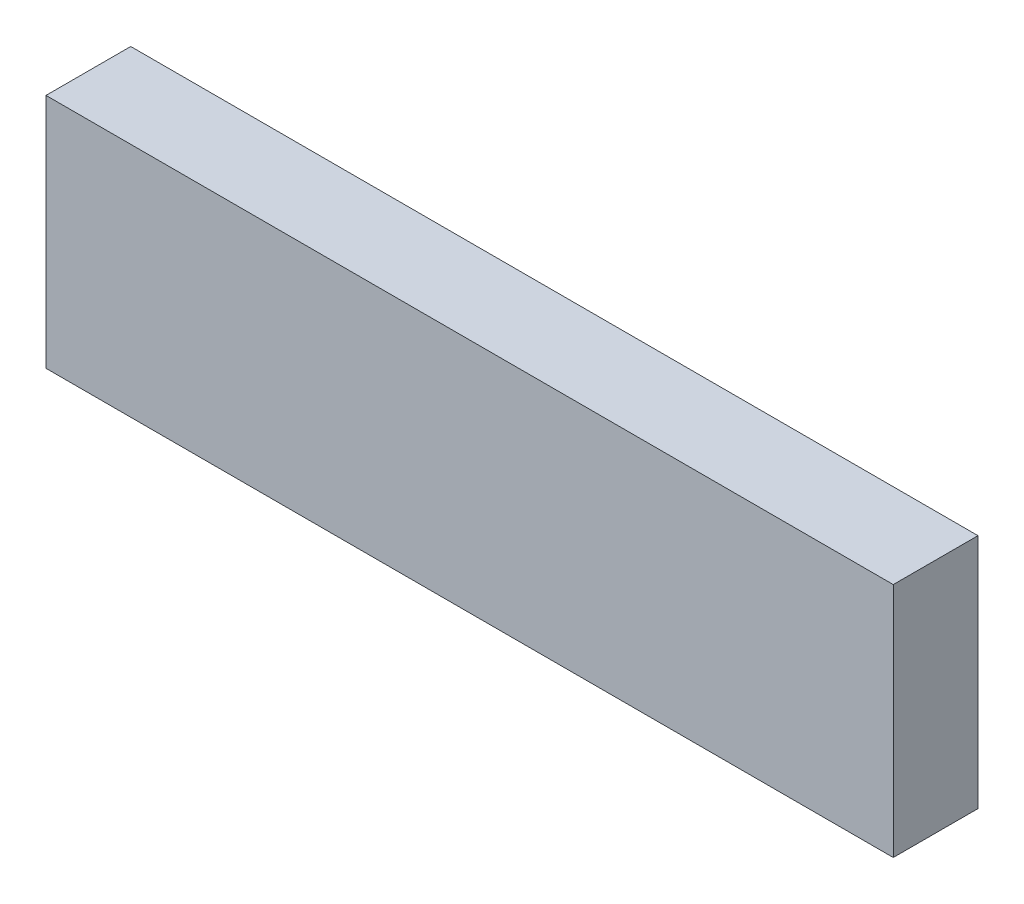
ISO-10303-21;
HEADER;
FILE_DESCRIPTION(('STEP AP214'),'2;1');
FILE_NAME('part.step','',(''),(''),'','','');
FILE_SCHEMA(('AUTOMOTIVE_DESIGN { 1 0 10303 214 1 1 1 1 }'));
ENDSEC;
DATA;
#1=APPLICATION_CONTEXT('core data for automotive mechanical design processes');
#2=APPLICATION_PROTOCOL_DEFINITION('international standard','automotive_design',2000,#1);
#3=PRODUCT_CONTEXT('',#1,'mechanical');
#4=PRODUCT('Part','Part','',(#3));
#5=PRODUCT_RELATED_PRODUCT_CATEGORY('part','',(#4));
#6=PRODUCT_DEFINITION_FORMATION('','',#4);
#7=PRODUCT_DEFINITION_CONTEXT('part definition',#1,'design');
#8=PRODUCT_DEFINITION('design','',#6,#7);
#9=PRODUCT_DEFINITION_SHAPE('','',#8);
#10=(LENGTH_UNIT() NAMED_UNIT(*) SI_UNIT(.MILLI.,.METRE.));
#11=(NAMED_UNIT(*) PLANE_ANGLE_UNIT() SI_UNIT($,.RADIAN.));
#12=(NAMED_UNIT(*) SI_UNIT($,.STERADIAN.) SOLID_ANGLE_UNIT());
#13=UNCERTAINTY_MEASURE_WITH_UNIT(LENGTH_MEASURE(1.E-05),#10,'distance_accuracy_value','');
#14=(GEOMETRIC_REPRESENTATION_CONTEXT(3) GLOBAL_UNCERTAINTY_ASSIGNED_CONTEXT((#13)) GLOBAL_UNIT_ASSIGNED_CONTEXT((#10,
#11,#12)) REPRESENTATION_CONTEXT('',''));
#15=CARTESIAN_POINT('',(0.,0.,0.));
#16=DIRECTION('',(0.,0.,1.));
#17=DIRECTION('',(1.,0.,0.));
#18=AXIS2_PLACEMENT_3D('',#15,#16,#17);
#19=CARTESIAN_POINT('',(0.,0.,5.));
#20=DIRECTION('',(1.,0.,0.));
#21=DIRECTION('',(0.,0.,-1.));
#22=AXIS2_PLACEMENT_3D('',#19,#20,#21);
#23=PLANE('',#22);
#24=DIRECTION('',(0.,-1.,0.));
#25=VECTOR('',#24,1.);
#26=CARTESIAN_POINT('',(0.,0.,0.));
#27=LINE('',#26,#25);
#28=CARTESIAN_POINT('',(0.,13.95,0.));
#29=VERTEX_POINT('',#28);
#30=CARTESIAN_POINT('',(0.,0.,0.));
#31=VERTEX_POINT('',#30);
#32=EDGE_CURVE('E107',#29,#31,#27,.T.);
#33=ORIENTED_EDGE('',*,*,#32,.T.);
#34=DIRECTION('',(0.,0.,-1.));
#35=VECTOR('',#34,1.);
#36=CARTESIAN_POINT('',(0.,0.,5.));
#37=LINE('',#36,#35);
#38=CARTESIAN_POINT('',(0.,0.,5.));
#39=VERTEX_POINT('',#38);
#40=EDGE_CURVE('E11',#39,#31,#37,.T.);
#41=ORIENTED_EDGE('',*,*,#40,.F.);
#42=DIRECTION('',(0.,-1.,0.));
#43=VECTOR('',#42,1.);
#44=CARTESIAN_POINT('',(0.,0.,5.));
#45=LINE('',#44,#43);
#46=CARTESIAN_POINT('',(0.,13.95,5.));
#47=VERTEX_POINT('',#46);
#48=EDGE_CURVE('E91',#47,#39,#45,.T.);
#49=ORIENTED_EDGE('',*,*,#48,.F.);
#50=DIRECTION('',(0.,0.,-1.));
#51=VECTOR('',#50,1.);
#52=CARTESIAN_POINT('',(0.,13.95,5.));
#53=LINE('',#52,#51);
#54=EDGE_CURVE('E103',#47,#29,#53,.T.);
#55=ORIENTED_EDGE('',*,*,#54,.T.);
#56=EDGE_LOOP('',(#33,#41,#49,#55));
#57=FACE_BOUND('',#56,.T.);
#58=ADVANCED_FACE('F39',(#57),#23,.F.);
#59=CARTESIAN_POINT('',(0.,0.,5.));
#60=DIRECTION('',(0.,1.,0.));
#61=DIRECTION('',(0.,0.,1.));
#62=AXIS2_PLACEMENT_3D('',#59,#60,#61);
#63=PLANE('',#62);
#64=DIRECTION('',(1.,0.,0.));
#65=VECTOR('',#64,1.);
#66=CARTESIAN_POINT('',(0.,0.,0.));
#67=LINE('',#66,#65);
#68=CARTESIAN_POINT('',(50.,0.,0.));
#69=VERTEX_POINT('',#68);
#70=EDGE_CURVE('E96',#31,#69,#67,.T.);
#71=ORIENTED_EDGE('',*,*,#70,.T.);
#72=DIRECTION('',(0.,0.,-1.));
#73=VECTOR('',#72,1.);
#74=CARTESIAN_POINT('',(50.,0.,5.));
#75=LINE('',#74,#73);
#76=CARTESIAN_POINT('',(50.,0.,5.));
#77=VERTEX_POINT('',#76);
#78=EDGE_CURVE('E48',#77,#69,#75,.T.);
#79=ORIENTED_EDGE('',*,*,#78,.F.);
#80=DIRECTION('',(1.,0.,0.));
#81=VECTOR('',#80,1.);
#82=CARTESIAN_POINT('',(0.,0.,5.));
#83=LINE('',#82,#81);
#84=EDGE_CURVE('E86',#39,#77,#83,.T.);
#85=ORIENTED_EDGE('',*,*,#84,.F.);
#86=ORIENTED_EDGE('',*,*,#40,.T.);
#87=EDGE_LOOP('',(#71,#79,#85,#86));
#88=FACE_BOUND('',#87,.T.);
#89=ADVANCED_FACE('F95',(#88),#63,.F.);
#90=CARTESIAN_POINT('',(50.,0.,5.));
#91=DIRECTION('',(-1.,0.,0.));
#92=DIRECTION('',(0.,0.,1.));
#93=AXIS2_PLACEMENT_3D('',#90,#91,#92);
#94=PLANE('',#93);
#95=DIRECTION('',(0.,1.,0.));
#96=VECTOR('',#95,1.);
#97=CARTESIAN_POINT('',(50.,0.,0.));
#98=LINE('',#97,#96);
#99=CARTESIAN_POINT('',(50.,13.95,0.));
#100=VERTEX_POINT('',#99);
#101=EDGE_CURVE('E73',#69,#100,#98,.T.);
#102=ORIENTED_EDGE('',*,*,#101,.T.);
#103=DIRECTION('',(0.,0.,-1.));
#104=VECTOR('',#103,1.);
#105=CARTESIAN_POINT('',(50.,13.95,5.));
#106=LINE('',#105,#104);
#107=CARTESIAN_POINT('',(50.,13.95,5.));
#108=VERTEX_POINT('',#107);
#109=EDGE_CURVE('E98',#108,#100,#106,.T.);
#110=ORIENTED_EDGE('',*,*,#109,.F.);
#111=DIRECTION('',(0.,1.,0.));
#112=VECTOR('',#111,1.);
#113=CARTESIAN_POINT('',(50.,0.,5.));
#114=LINE('',#113,#112);
#115=EDGE_CURVE('E89',#77,#108,#114,.T.);
#116=ORIENTED_EDGE('',*,*,#115,.F.);
#117=ORIENTED_EDGE('',*,*,#78,.T.);
#118=EDGE_LOOP('',(#102,#110,#116,#117));
#119=FACE_BOUND('',#118,.T.);
#120=ADVANCED_FACE('F99',(#119),#94,.F.);
#121=CARTESIAN_POINT('',(0.,13.95,5.));
#122=DIRECTION('',(0.,-1.,0.));
#123=DIRECTION('',(1.,0.,0.));
#124=AXIS2_PLACEMENT_3D('',#121,#122,#123);
#125=PLANE('',#124);
#126=DIRECTION('',(-1.,0.,0.));
#127=VECTOR('',#126,1.);
#128=CARTESIAN_POINT('',(0.,13.95,0.));
#129=LINE('',#128,#127);
#130=EDGE_CURVE('E79',#100,#29,#129,.T.);
#131=ORIENTED_EDGE('',*,*,#130,.T.);
#132=ORIENTED_EDGE('',*,*,#54,.F.);
#133=DIRECTION('',(-1.,0.,0.));
#134=VECTOR('',#133,1.);
#135=CARTESIAN_POINT('',(0.,13.95,5.));
#136=LINE('',#135,#134);
#137=EDGE_CURVE('E56',#108,#47,#136,.T.);
#138=ORIENTED_EDGE('',*,*,#137,.F.);
#139=ORIENTED_EDGE('',*,*,#109,.T.);
#140=EDGE_LOOP('',(#131,#132,#138,#139));
#141=FACE_BOUND('',#140,.T.);
#142=ADVANCED_FACE('F120',(#141),#125,.F.);
#143=CARTESIAN_POINT('',(0.,0.,5.));
#144=DIRECTION('',(0.,0.,-1.));
#145=DIRECTION('',(-1.,0.,0.));
#146=AXIS2_PLACEMENT_3D('',#143,#144,#145);
#147=PLANE('',#146);
#148=ORIENTED_EDGE('',*,*,#48,.T.);
#149=ORIENTED_EDGE('',*,*,#84,.T.);
#150=ORIENTED_EDGE('',*,*,#115,.T.);
#151=ORIENTED_EDGE('',*,*,#137,.T.);
#152=EDGE_LOOP('',(#148,#149,#150,#151));
#153=FACE_BOUND('',#152,.T.);
#154=ADVANCED_FACE('F87',(#153),#147,.F.);
#155=CARTESIAN_POINT('',(0.,0.,0.));
#156=DIRECTION('',(0.,0.,-1.));
#157=DIRECTION('',(-1.,0.,0.));
#158=AXIS2_PLACEMENT_3D('',#155,#156,#157);
#159=PLANE('',#158);
#160=ORIENTED_EDGE('',*,*,#32,.F.);
#161=ORIENTED_EDGE('',*,*,#130,.F.);
#162=ORIENTED_EDGE('',*,*,#101,.F.);
#163=ORIENTED_EDGE('',*,*,#70,.F.);
#164=EDGE_LOOP('',(#160,#161,#162,#163));
#165=FACE_BOUND('',#164,.T.);
#166=ADVANCED_FACE('F123',(#165),#159,.T.);
#167=CLOSED_SHELL('',(#58,#89,#120,#142,#154,#166));
#168=MANIFOLD_SOLID_BREP('B2',#167);
#169=ADVANCED_BREP_SHAPE_REPRESENTATION('',(#18,#168),#14);
#170=SHAPE_DEFINITION_REPRESENTATION(#9,#169);
ENDSEC;
END-ISO-10303-21;
